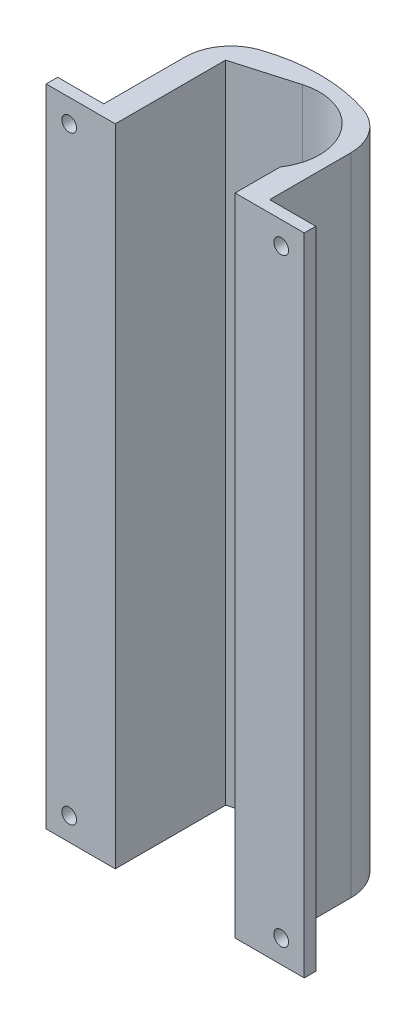
ISO-10303-21;
HEADER;
FILE_DESCRIPTION(('STEP AP214'),'2;1');
FILE_NAME('part.step','',(''),(''),'','','');
FILE_SCHEMA(('AUTOMOTIVE_DESIGN { 1 0 10303 214 1 1 1 1 }'));
ENDSEC;
DATA;
#1=APPLICATION_CONTEXT('core data for automotive mechanical design processes');
#2=APPLICATION_PROTOCOL_DEFINITION('international standard','automotive_design',2000,#1);
#3=PRODUCT_CONTEXT('',#1,'mechanical');
#4=PRODUCT('Part','Part','',(#3));
#5=PRODUCT_RELATED_PRODUCT_CATEGORY('part','',(#4));
#6=PRODUCT_DEFINITION_FORMATION('','',#4);
#7=PRODUCT_DEFINITION_CONTEXT('part definition',#1,'design');
#8=PRODUCT_DEFINITION('design','',#6,#7);
#9=PRODUCT_DEFINITION_SHAPE('','',#8);
#10=(LENGTH_UNIT() NAMED_UNIT(*) SI_UNIT(.MILLI.,.METRE.));
#11=(NAMED_UNIT(*) PLANE_ANGLE_UNIT() SI_UNIT($,.RADIAN.));
#12=(NAMED_UNIT(*) SI_UNIT($,.STERADIAN.) SOLID_ANGLE_UNIT());
#13=UNCERTAINTY_MEASURE_WITH_UNIT(LENGTH_MEASURE(1.E-05),#10,'distance_accuracy_value','');
#14=(GEOMETRIC_REPRESENTATION_CONTEXT(3) GLOBAL_UNCERTAINTY_ASSIGNED_CONTEXT((#13)) GLOBAL_UNIT_ASSIGNED_CONTEXT((#10,
#11,#12)) REPRESENTATION_CONTEXT('',''));
#15=CARTESIAN_POINT('',(0.,0.,0.));
#16=DIRECTION('',(0.,0.,1.));
#17=DIRECTION('',(1.,0.,0.));
#18=AXIS2_PLACEMENT_3D('',#15,#16,#17);
#19=CARTESIAN_POINT('',(0.,177.8,74.9201803451045));
#20=DIRECTION('',(0.,-1.,0.));
#21=DIRECTION('',(0.,0.,-1.));
#22=AXIS2_PLACEMENT_3D('',#19,#20,#21);
#23=CYLINDRICAL_SURFACE('',#22,14.9862811380157);
#24=CARTESIAN_POINT('',(0.,0.,74.9201803451045));
#25=DIRECTION('',(0.,-1.,0.));
#26=DIRECTION('',(0.,0.,-1.));
#27=AXIS2_PLACEMENT_3D('',#24,#25,#26);
#28=CIRCLE('',#27,14.9862811380157);
#29=CARTESIAN_POINT('',(-4.16201958345776,0.,60.5234371253843));
#30=VERTEX_POINT('',#29);
#31=CARTESIAN_POINT('',(12.446,0.,83.2679768416446));
#32=VERTEX_POINT('',#31);
#33=EDGE_CURVE('E178',#30,#32,#28,.T.);
#34=ORIENTED_EDGE('',*,*,#33,.T.);
#35=DIRECTION('',(0.,-1.,0.));
#36=VECTOR('',#35,1.);
#37=CARTESIAN_POINT('',(12.446,177.8,83.2679768416446));
#38=LINE('',#37,#36);
#39=CARTESIAN_POINT('',(12.446,177.8,83.2679768416446));
#40=VERTEX_POINT('',#39);
#41=EDGE_CURVE('E158',#40,#32,#38,.T.);
#42=ORIENTED_EDGE('',*,*,#41,.F.);
#43=CARTESIAN_POINT('',(0.,177.8,74.9201803451045));
#44=DIRECTION('',(0.,-1.,0.));
#45=DIRECTION('',(0.,0.,-1.));
#46=AXIS2_PLACEMENT_3D('',#43,#44,#45);
#47=CIRCLE('',#46,14.9862811380157);
#48=CARTESIAN_POINT('',(-4.16201958345776,177.8,60.5234371253843));
#49=VERTEX_POINT('',#48);
#50=EDGE_CURVE('E165',#49,#40,#47,.T.);
#51=ORIENTED_EDGE('',*,*,#50,.F.);
#52=DIRECTION('',(0.,-1.,0.));
#53=VECTOR('',#52,1.);
#54=CARTESIAN_POINT('',(-4.16201958345776,177.8,60.5234371253843));
#55=LINE('',#54,#53);
#56=EDGE_CURVE('E256',#49,#30,#55,.T.);
#57=ORIENTED_EDGE('',*,*,#56,.T.);
#58=EDGE_LOOP('',(#34,#42,#51,#57));
#59=FACE_BOUND('',#58,.T.);
#60=ADVANCED_FACE('F43',(#59),#23,.F.);
#61=CARTESIAN_POINT('',(12.446,177.8,95.666893232235));
#62=DIRECTION('',(1.,0.,0.));
#63=DIRECTION('',(0.,0.,-1.));
#64=AXIS2_PLACEMENT_3D('',#61,#62,#63);
#65=PLANE('',#64);
#66=DIRECTION('',(0.,0.,1.));
#67=VECTOR('',#66,1.);
#68=CARTESIAN_POINT('',(12.446,0.,95.666893232235));
#69=LINE('',#68,#67);
#70=CARTESIAN_POINT('',(12.446,0.,95.666893232235));
#71=VERTEX_POINT('',#70);
#72=EDGE_CURVE('E298',#32,#71,#69,.T.);
#73=ORIENTED_EDGE('',*,*,#72,.T.);
#74=DIRECTION('',(0.,-1.,0.));
#75=VECTOR('',#74,1.);
#76=CARTESIAN_POINT('',(12.446,177.8,95.666893232235));
#77=LINE('',#76,#75);
#78=CARTESIAN_POINT('',(12.446,177.8,95.666893232235));
#79=VERTEX_POINT('',#78);
#80=EDGE_CURVE('E161',#79,#71,#77,.T.);
#81=ORIENTED_EDGE('',*,*,#80,.F.);
#82=DIRECTION('',(0.,0.,1.));
#83=VECTOR('',#82,1.);
#84=CARTESIAN_POINT('',(12.446,177.8,95.666893232235));
#85=LINE('',#84,#83);
#86=EDGE_CURVE('E154',#40,#79,#85,.T.);
#87=ORIENTED_EDGE('',*,*,#86,.F.);
#88=ORIENTED_EDGE('',*,*,#41,.T.);
#89=EDGE_LOOP('',(#73,#81,#87,#88));
#90=FACE_BOUND('',#89,.T.);
#91=ADVANCED_FACE('F156',(#90),#65,.F.);
#92=CARTESIAN_POINT('',(12.446,177.8,95.666893232235));
#93=DIRECTION('',(0.,0.,-1.));
#94=DIRECTION('',(-1.,0.,0.));
#95=AXIS2_PLACEMENT_3D('',#92,#93,#94);
#96=PLANE('',#95);
#97=CARTESIAN_POINT('',(25.146,6.35,95.666893232235));
#98=DIRECTION('',(0.,0.,-1.));
#99=DIRECTION('',(-1.,0.,0.));
#100=AXIS2_PLACEMENT_3D('',#97,#98,#99);
#101=CIRCLE('',#100,2.03200000000001);
#102=CARTESIAN_POINT('',(23.114,6.35,95.666893232235));
#103=VERTEX_POINT('',#102);
#104=EDGE_CURVE('E335',#103,#103,#101,.T.);
#105=ORIENTED_EDGE('',*,*,#104,.T.);
#106=EDGE_LOOP('',(#105));
#107=FACE_BOUND('',#106,.T.);
#108=CARTESIAN_POINT('',(25.146,171.45,95.666893232235));
#109=DIRECTION('',(0.,0.,-1.));
#110=DIRECTION('',(-1.,0.,0.));
#111=AXIS2_PLACEMENT_3D('',#108,#109,#110);
#112=CIRCLE('',#111,2.03200000000002);
#113=CARTESIAN_POINT('',(23.114,171.45,95.666893232235));
#114=VERTEX_POINT('',#113);
#115=EDGE_CURVE('E305',#114,#114,#112,.T.);
#116=ORIENTED_EDGE('',*,*,#115,.T.);
#117=EDGE_LOOP('',(#116));
#118=FACE_BOUND('',#117,.T.);
#119=DIRECTION('',(1.,0.,0.));
#120=VECTOR('',#119,1.);
#121=CARTESIAN_POINT('',(12.446,0.,95.666893232235));
#122=LINE('',#121,#120);
#123=CARTESIAN_POINT('',(31.496,0.,95.666893232235));
#124=VERTEX_POINT('',#123);
#125=EDGE_CURVE('E295',#71,#124,#122,.T.);
#126=ORIENTED_EDGE('',*,*,#125,.T.);
#127=DIRECTION('',(0.,-1.,0.));
#128=VECTOR('',#127,1.);
#129=CARTESIAN_POINT('',(31.496,177.8,95.666893232235));
#130=LINE('',#129,#128);
#131=CARTESIAN_POINT('',(31.496,177.8,95.666893232235));
#132=VERTEX_POINT('',#131);
#133=EDGE_CURVE('E186',#132,#124,#130,.T.);
#134=ORIENTED_EDGE('',*,*,#133,.F.);
#135=DIRECTION('',(1.,0.,0.));
#136=VECTOR('',#135,1.);
#137=CARTESIAN_POINT('',(12.446,177.8,95.666893232235));
#138=LINE('',#137,#136);
#139=EDGE_CURVE('E164',#79,#132,#138,.T.);
#140=ORIENTED_EDGE('',*,*,#139,.F.);
#141=ORIENTED_EDGE('',*,*,#80,.T.);
#142=EDGE_LOOP('',(#126,#134,#140,#141));
#143=FACE_BOUND('',#142,.T.);
#144=ADVANCED_FACE('F409',(#107,#118,#143),#96,.F.);
#145=CARTESIAN_POINT('',(31.496,177.8,95.666893232235));
#146=DIRECTION('',(-1.,0.,0.));
#147=DIRECTION('',(0.,0.,1.));
#148=AXIS2_PLACEMENT_3D('',#145,#146,#147);
#149=PLANE('',#148);
#150=DIRECTION('',(0.,0.,-1.));
#151=VECTOR('',#150,1.);
#152=CARTESIAN_POINT('',(31.496,0.,95.666893232235));
#153=LINE('',#152,#151);
#154=CARTESIAN_POINT('',(31.496,0.,92.491893232235));
#155=VERTEX_POINT('',#154);
#156=EDGE_CURVE('E235',#124,#155,#153,.T.);
#157=ORIENTED_EDGE('',*,*,#156,.T.);
#158=DIRECTION('',(0.,-1.,0.));
#159=VECTOR('',#158,1.);
#160=CARTESIAN_POINT('',(31.496,177.8,92.491893232235));
#161=LINE('',#160,#159);
#162=CARTESIAN_POINT('',(31.496,177.8,92.491893232235));
#163=VERTEX_POINT('',#162);
#164=EDGE_CURVE('E281',#163,#155,#161,.T.);
#165=ORIENTED_EDGE('',*,*,#164,.F.);
#166=DIRECTION('',(0.,0.,-1.));
#167=VECTOR('',#166,1.);
#168=CARTESIAN_POINT('',(31.496,177.8,95.666893232235));
#169=LINE('',#168,#167);
#170=EDGE_CURVE('E292',#132,#163,#169,.T.);
#171=ORIENTED_EDGE('',*,*,#170,.F.);
#172=ORIENTED_EDGE('',*,*,#133,.T.);
#173=EDGE_LOOP('',(#157,#165,#171,#172));
#174=FACE_BOUND('',#173,.T.);
#175=ADVANCED_FACE('F290',(#174),#149,.F.);
#176=CARTESIAN_POINT('',(31.496,177.8,92.491893232235));
#177=DIRECTION('',(0.,0.,1.));
#178=DIRECTION('',(1.,0.,0.));
#179=AXIS2_PLACEMENT_3D('',#176,#177,#178);
#180=PLANE('',#179);
#181=CARTESIAN_POINT('',(25.146,6.35,92.491893232235));
#182=DIRECTION('',(0.,0.,-1.));
#183=DIRECTION('',(-1.,0.,0.));
#184=AXIS2_PLACEMENT_3D('',#181,#182,#183);
#185=CIRCLE('',#184,2.03200000000001);
#186=CARTESIAN_POINT('',(23.114,6.35,92.491893232235));
#187=VERTEX_POINT('',#186);
#188=EDGE_CURVE('E348',#187,#187,#185,.T.);
#189=ORIENTED_EDGE('',*,*,#188,.F.);
#190=EDGE_LOOP('',(#189));
#191=FACE_BOUND('',#190,.T.);
#192=CARTESIAN_POINT('',(25.146,171.45,92.491893232235));
#193=DIRECTION('',(0.,0.,-1.));
#194=DIRECTION('',(-1.,0.,0.));
#195=AXIS2_PLACEMENT_3D('',#192,#193,#194);
#196=CIRCLE('',#195,2.03200000000002);
#197=CARTESIAN_POINT('',(23.114,171.45,92.491893232235));
#198=VERTEX_POINT('',#197);
#199=EDGE_CURVE('E331',#198,#198,#196,.T.);
#200=ORIENTED_EDGE('',*,*,#199,.F.);
#201=EDGE_LOOP('',(#200));
#202=FACE_BOUND('',#201,.T.);
#203=DIRECTION('',(-1.,0.,0.));
#204=VECTOR('',#203,1.);
#205=CARTESIAN_POINT('',(31.496,0.,92.491893232235));
#206=LINE('',#205,#204);
#207=CARTESIAN_POINT('',(18.796,0.,92.491893232235));
#208=VERTEX_POINT('',#207);
#209=EDGE_CURVE('E229',#155,#208,#206,.T.);
#210=ORIENTED_EDGE('',*,*,#209,.T.);
#211=DIRECTION('',(0.,-1.,0.));
#212=VECTOR('',#211,1.);
#213=CARTESIAN_POINT('',(18.796,177.8,92.491893232235));
#214=LINE('',#213,#212);
#215=CARTESIAN_POINT('',(18.796,177.8,92.491893232235));
#216=VERTEX_POINT('',#215);
#217=EDGE_CURVE('E227',#216,#208,#214,.T.);
#218=ORIENTED_EDGE('',*,*,#217,.F.);
#219=DIRECTION('',(-1.,0.,0.));
#220=VECTOR('',#219,1.);
#221=CARTESIAN_POINT('',(31.496,177.8,92.491893232235));
#222=LINE('',#221,#220);
#223=EDGE_CURVE('E324',#163,#216,#222,.T.);
#224=ORIENTED_EDGE('',*,*,#223,.F.);
#225=ORIENTED_EDGE('',*,*,#164,.T.);
#226=EDGE_LOOP('',(#210,#218,#224,#225));
#227=FACE_BOUND('',#226,.T.);
#228=ADVANCED_FACE('F417',(#191,#202,#227),#180,.F.);
#229=CARTESIAN_POINT('',(18.796,177.8,92.491893232235));
#230=DIRECTION('',(-1.,0.,0.));
#231=DIRECTION('',(0.,0.,1.));
#232=AXIS2_PLACEMENT_3D('',#229,#230,#231);
#233=PLANE('',#232);
#234=DIRECTION('',(0.,0.,-1.));
#235=VECTOR('',#234,1.);
#236=CARTESIAN_POINT('',(18.796,0.,92.491893232235));
#237=LINE('',#236,#235);
#238=CARTESIAN_POINT('',(18.796,0.,70.1337045539243));
#239=VERTEX_POINT('',#238);
#240=EDGE_CURVE('E222',#208,#239,#237,.T.);
#241=ORIENTED_EDGE('',*,*,#240,.T.);
#242=DIRECTION('',(0.,-1.,0.));
#243=VECTOR('',#242,1.);
#244=CARTESIAN_POINT('',(18.796,177.8,70.1337045539243));
#245=LINE('',#244,#243);
#246=CARTESIAN_POINT('',(18.796,177.8,70.1337045539243));
#247=VERTEX_POINT('',#246);
#248=EDGE_CURVE('E67',#239,#247,#245,.F.);
#249=ORIENTED_EDGE('',*,*,#248,.T.);
#250=DIRECTION('',(0.,0.,-1.));
#251=VECTOR('',#250,1.);
#252=CARTESIAN_POINT('',(18.796,177.8,92.491893232235));
#253=LINE('',#252,#251);
#254=EDGE_CURVE('E206',#216,#247,#253,.T.);
#255=ORIENTED_EDGE('',*,*,#254,.F.);
#256=ORIENTED_EDGE('',*,*,#217,.T.);
#257=EDGE_LOOP('',(#241,#249,#255,#256));
#258=FACE_BOUND('',#257,.T.);
#259=ADVANCED_FACE('F225',(#258),#233,.F.);
#260=CARTESIAN_POINT('',(-4.064,177.8,100.214211531035));
#261=DIRECTION('',(0.,-1.,0.));
#262=DIRECTION('',(0.,0.,-1.));
#263=AXIS2_PLACEMENT_3D('',#260,#261,#262);
#264=CYLINDRICAL_SURFACE('',#263,44.45);
#265=CARTESIAN_POINT('',(-4.064,177.8,100.214211531035));
#266=DIRECTION('',(0.,1.,0.));
#267=DIRECTION('',(0.,0.,-1.));
#268=AXIS2_PLACEMENT_3D('',#265,#266,#267);
#269=CIRCLE('',#268,44.45);
#270=CARTESIAN_POINT('',(10.16,177.8,58.1015017630801));
#271=VERTEX_POINT('',#270);
#272=CARTESIAN_POINT('',(-18.288,177.8,58.1015017630801));
#273=VERTEX_POINT('',#272);
#274=EDGE_CURVE('E205',#271,#273,#269,.T.);
#275=ORIENTED_EDGE('',*,*,#274,.F.);
#276=DIRECTION('',(0.,-1.,0.));
#277=VECTOR('',#276,1.);
#278=CARTESIAN_POINT('',(10.16,177.8,58.1015017630801));
#279=LINE('',#278,#277);
#280=CARTESIAN_POINT('',(10.16,0.,58.1015017630801));
#281=VERTEX_POINT('',#280);
#282=EDGE_CURVE('E184',#271,#281,#279,.T.);
#283=ORIENTED_EDGE('',*,*,#282,.T.);
#284=CARTESIAN_POINT('',(-4.064,0.,100.214211531035));
#285=DIRECTION('',(0.,1.,0.));
#286=DIRECTION('',(0.,0.,-1.));
#287=AXIS2_PLACEMENT_3D('',#284,#285,#286);
#288=CIRCLE('',#287,44.45);
#289=CARTESIAN_POINT('',(-18.288,0.,58.1015017630801));
#290=VERTEX_POINT('',#289);
#291=EDGE_CURVE('E223',#281,#290,#288,.T.);
#292=ORIENTED_EDGE('',*,*,#291,.T.);
#293=DIRECTION('',(0.,-1.,0.));
#294=VECTOR('',#293,1.);
#295=CARTESIAN_POINT('',(-18.288,177.8,58.1015017630801));
#296=LINE('',#295,#294);
#297=EDGE_CURVE('E180',#290,#273,#296,.F.);
#298=ORIENTED_EDGE('',*,*,#297,.T.);
#299=EDGE_LOOP('',(#275,#283,#292,#298));
#300=FACE_BOUND('',#299,.T.);
#301=ADVANCED_FACE('F210',(#300),#264,.T.);
#302=CARTESIAN_POINT('',(-26.924,177.8,92.491893232235));
#303=DIRECTION('',(1.,0.,0.));
#304=DIRECTION('',(0.,0.,-1.));
#305=AXIS2_PLACEMENT_3D('',#302,#303,#304);
#306=PLANE('',#305);
#307=DIRECTION('',(0.,0.,1.));
#308=VECTOR('',#307,1.);
#309=CARTESIAN_POINT('',(-26.924,177.8,92.491893232235));
#310=LINE('',#309,#308);
#311=CARTESIAN_POINT('',(-26.924,177.8,70.1337045539244));
#312=VERTEX_POINT('',#311);
#313=CARTESIAN_POINT('',(-26.924,177.8,92.491893232235));
#314=VERTEX_POINT('',#313);
#315=EDGE_CURVE('E215',#312,#314,#310,.T.);
#316=ORIENTED_EDGE('',*,*,#315,.F.);
#317=DIRECTION('',(0.,-1.,0.));
#318=VECTOR('',#317,1.);
#319=CARTESIAN_POINT('',(-26.924,177.8,70.1337045539244));
#320=LINE('',#319,#318);
#321=CARTESIAN_POINT('',(-26.924,0.,70.1337045539244));
#322=VERTEX_POINT('',#321);
#323=EDGE_CURVE('E11',#312,#322,#320,.T.);
#324=ORIENTED_EDGE('',*,*,#323,.T.);
#325=DIRECTION('',(0.,0.,1.));
#326=VECTOR('',#325,1.);
#327=CARTESIAN_POINT('',(-26.924,0.,92.491893232235));
#328=LINE('',#327,#326);
#329=CARTESIAN_POINT('',(-26.924,0.,92.491893232235));
#330=VERTEX_POINT('',#329);
#331=EDGE_CURVE('E233',#322,#330,#328,.T.);
#332=ORIENTED_EDGE('',*,*,#331,.T.);
#333=DIRECTION('',(0.,-1.,0.));
#334=VECTOR('',#333,1.);
#335=CARTESIAN_POINT('',(-26.924,177.8,92.491893232235));
#336=LINE('',#335,#334);
#337=EDGE_CURVE('E275',#314,#330,#336,.T.);
#338=ORIENTED_EDGE('',*,*,#337,.F.);
#339=EDGE_LOOP('',(#316,#324,#332,#338));
#340=FACE_BOUND('',#339,.T.);
#341=ADVANCED_FACE('F377',(#340),#306,.F.);
#342=CARTESIAN_POINT('',(-39.624,177.8,92.491893232235));
#343=DIRECTION('',(0.,0.,1.));
#344=DIRECTION('',(1.,0.,0.));
#345=AXIS2_PLACEMENT_3D('',#342,#343,#344);
#346=PLANE('',#345);
#347=CARTESIAN_POINT('',(-33.274,171.45,92.491893232235));
#348=DIRECTION('',(0.,0.,-1.));
#349=DIRECTION('',(-1.,0.,0.));
#350=AXIS2_PLACEMENT_3D('',#347,#348,#349);
#351=CIRCLE('',#350,2.03200000000003);
#352=CARTESIAN_POINT('',(-35.306,171.45,92.491893232235));
#353=VERTEX_POINT('',#352);
#354=EDGE_CURVE('E339',#353,#353,#351,.T.);
#355=ORIENTED_EDGE('',*,*,#354,.F.);
#356=EDGE_LOOP('',(#355));
#357=FACE_BOUND('',#356,.T.);
#358=CARTESIAN_POINT('',(-33.2739999999999,6.35000000000002,92.491893232235));
#359=DIRECTION('',(0.,0.,-1.));
#360=DIRECTION('',(-1.,0.,0.));
#361=AXIS2_PLACEMENT_3D('',#358,#359,#360);
#362=CIRCLE('',#361,2.03200000000001);
#363=CARTESIAN_POINT('',(-35.3059999999999,6.35000000000002,92.491893232235));
#364=VERTEX_POINT('',#363);
#365=EDGE_CURVE('E355',#364,#364,#362,.T.);
#366=ORIENTED_EDGE('',*,*,#365,.F.);
#367=EDGE_LOOP('',(#366));
#368=FACE_BOUND('',#367,.T.);
#369=DIRECTION('',(-1.,0.,0.));
#370=VECTOR('',#369,1.);
#371=CARTESIAN_POINT('',(-39.624,0.,92.491893232235));
#372=LINE('',#371,#370);
#373=CARTESIAN_POINT('',(-39.624,0.,92.491893232235));
#374=VERTEX_POINT('',#373);
#375=EDGE_CURVE('E241',#330,#374,#372,.T.);
#376=ORIENTED_EDGE('',*,*,#375,.T.);
#377=DIRECTION('',(0.,-1.,0.));
#378=VECTOR('',#377,1.);
#379=CARTESIAN_POINT('',(-39.624,177.8,92.491893232235));
#380=LINE('',#379,#378);
#381=CARTESIAN_POINT('',(-39.624,177.8,92.491893232235));
#382=VERTEX_POINT('',#381);
#383=EDGE_CURVE('E271',#382,#374,#380,.T.);
#384=ORIENTED_EDGE('',*,*,#383,.F.);
#385=DIRECTION('',(-1.,0.,0.));
#386=VECTOR('',#385,1.);
#387=CARTESIAN_POINT('',(-39.624,177.8,92.491893232235));
#388=LINE('',#387,#386);
#389=EDGE_CURVE('E317',#314,#382,#388,.T.);
#390=ORIENTED_EDGE('',*,*,#389,.F.);
#391=ORIENTED_EDGE('',*,*,#337,.T.);
#392=EDGE_LOOP('',(#376,#384,#390,#391));
#393=FACE_BOUND('',#392,.T.);
#394=ADVANCED_FACE('F373',(#357,#368,#393),#346,.F.);
#395=CARTESIAN_POINT('',(-39.624,177.8,95.666893232235));
#396=DIRECTION('',(1.,0.,0.));
#397=DIRECTION('',(0.,0.,-1.));
#398=AXIS2_PLACEMENT_3D('',#395,#396,#397);
#399=PLANE('',#398);
#400=DIRECTION('',(0.,0.,1.));
#401=VECTOR('',#400,1.);
#402=CARTESIAN_POINT('',(-39.624,0.,95.666893232235));
#403=LINE('',#402,#401);
#404=CARTESIAN_POINT('',(-39.624,0.,95.666893232235));
#405=VERTEX_POINT('',#404);
#406=EDGE_CURVE('E244',#374,#405,#403,.T.);
#407=ORIENTED_EDGE('',*,*,#406,.T.);
#408=DIRECTION('',(0.,-1.,0.));
#409=VECTOR('',#408,1.);
#410=CARTESIAN_POINT('',(-39.624,177.8,95.666893232235));
#411=LINE('',#410,#409);
#412=CARTESIAN_POINT('',(-39.624,177.8,95.666893232235));
#413=VERTEX_POINT('',#412);
#414=EDGE_CURVE('E267',#413,#405,#411,.T.);
#415=ORIENTED_EDGE('',*,*,#414,.F.);
#416=DIRECTION('',(0.,0.,1.));
#417=VECTOR('',#416,1.);
#418=CARTESIAN_POINT('',(-39.624,177.8,95.666893232235));
#419=LINE('',#418,#417);
#420=EDGE_CURVE('E314',#382,#413,#419,.T.);
#421=ORIENTED_EDGE('',*,*,#420,.F.);
#422=ORIENTED_EDGE('',*,*,#383,.T.);
#423=EDGE_LOOP('',(#407,#415,#421,#422));
#424=FACE_BOUND('',#423,.T.);
#425=ADVANCED_FACE('F376',(#424),#399,.F.);
#426=CARTESIAN_POINT('',(-39.624,177.8,95.666893232235));
#427=DIRECTION('',(0.,0.,-1.));
#428=DIRECTION('',(-1.,0.,0.));
#429=AXIS2_PLACEMENT_3D('',#426,#427,#428);
#430=PLANE('',#429);
#431=CARTESIAN_POINT('',(-33.274,171.45,95.666893232235));
#432=DIRECTION('',(0.,0.,-1.));
#433=DIRECTION('',(-1.,0.,0.));
#434=AXIS2_PLACEMENT_3D('',#431,#432,#433);
#435=CIRCLE('',#434,2.03200000000003);
#436=CARTESIAN_POINT('',(-35.306,171.45,95.666893232235));
#437=VERTEX_POINT('',#436);
#438=EDGE_CURVE('E343',#437,#437,#435,.T.);
#439=ORIENTED_EDGE('',*,*,#438,.T.);
#440=EDGE_LOOP('',(#439));
#441=FACE_BOUND('',#440,.T.);
#442=CARTESIAN_POINT('',(-33.2739999999999,6.35000000000002,95.666893232235));
#443=DIRECTION('',(0.,0.,-1.));
#444=DIRECTION('',(-1.,0.,0.));
#445=AXIS2_PLACEMENT_3D('',#442,#443,#444);
#446=CIRCLE('',#445,2.03200000000001);
#447=CARTESIAN_POINT('',(-35.3059999999999,6.35000000000002,95.666893232235));
#448=VERTEX_POINT('',#447);
#449=EDGE_CURVE('E344',#448,#448,#446,.T.);
#450=ORIENTED_EDGE('',*,*,#449,.T.);
#451=EDGE_LOOP('',(#450));
#452=FACE_BOUND('',#451,.T.);
#453=DIRECTION('',(1.,0.,0.));
#454=VECTOR('',#453,1.);
#455=CARTESIAN_POINT('',(-39.624,0.,95.666893232235));
#456=LINE('',#455,#454);
#457=CARTESIAN_POINT('',(-20.574,0.,95.666893232235));
#458=VERTEX_POINT('',#457);
#459=EDGE_CURVE('E247',#405,#458,#456,.T.);
#460=ORIENTED_EDGE('',*,*,#459,.T.);
#461=DIRECTION('',(0.,-1.,0.));
#462=VECTOR('',#461,1.);
#463=CARTESIAN_POINT('',(-20.574,177.8,95.666893232235));
#464=LINE('',#463,#462);
#465=CARTESIAN_POINT('',(-20.574,177.8,95.666893232235));
#466=VERTEX_POINT('',#465);
#467=EDGE_CURVE('E263',#466,#458,#464,.T.);
#468=ORIENTED_EDGE('',*,*,#467,.F.);
#469=DIRECTION('',(1.,0.,0.));
#470=VECTOR('',#469,1.);
#471=CARTESIAN_POINT('',(-39.624,177.8,95.666893232235));
#472=LINE('',#471,#470);
#473=EDGE_CURVE('E311',#413,#466,#472,.T.);
#474=ORIENTED_EDGE('',*,*,#473,.F.);
#475=ORIENTED_EDGE('',*,*,#414,.T.);
#476=EDGE_LOOP('',(#460,#468,#474,#475));
#477=FACE_BOUND('',#476,.T.);
#478=ADVANCED_FACE('F363',(#441,#452,#477),#430,.F.);
#479=CARTESIAN_POINT('',(-20.574,177.8,84.5721803451045));
#480=DIRECTION('',(-1.,0.,0.));
#481=DIRECTION('',(0.,0.,1.));
#482=AXIS2_PLACEMENT_3D('',#479,#480,#481);
#483=PLANE('',#482);
#484=DIRECTION('',(0.,0.,-1.));
#485=VECTOR('',#484,1.);
#486=CARTESIAN_POINT('',(-20.574,0.,84.5721803451045));
#487=LINE('',#486,#485);
#488=CARTESIAN_POINT('',(-20.574,0.,65.2680507407337));
#489=VERTEX_POINT('',#488);
#490=EDGE_CURVE('E251',#458,#489,#487,.T.);
#491=ORIENTED_EDGE('',*,*,#490,.T.);
#492=DIRECTION('',(0.,-1.,0.));
#493=VECTOR('',#492,1.);
#494=CARTESIAN_POINT('',(-20.574,177.8,65.2680507407337));
#495=LINE('',#494,#493);
#496=CARTESIAN_POINT('',(-20.574,177.8,65.2680507407337));
#497=VERTEX_POINT('',#496);
#498=EDGE_CURVE('E259',#497,#489,#495,.T.);
#499=ORIENTED_EDGE('',*,*,#498,.F.);
#500=DIRECTION('',(0.,0.,-1.));
#501=VECTOR('',#500,1.);
#502=CARTESIAN_POINT('',(-20.574,177.8,84.5721803451045));
#503=LINE('',#502,#501);
#504=EDGE_CURVE('E308',#466,#497,#503,.T.);
#505=ORIENTED_EDGE('',*,*,#504,.F.);
#506=ORIENTED_EDGE('',*,*,#467,.T.);
#507=EDGE_LOOP('',(#491,#499,#505,#506));
#508=FACE_BOUND('',#507,.T.);
#509=ADVANCED_FACE('F395',(#508),#483,.F.);
#510=CARTESIAN_POINT('',(-20.574,177.8,65.2680507407337));
#511=DIRECTION('',(-0.27772197419278,0.,-0.960661493477523));
#512=DIRECTION('',(-0.960661493477523,0.,0.27772197419278));
#513=AXIS2_PLACEMENT_3D('',#510,#511,#512);
#514=PLANE('',#513);
#515=DIRECTION('',(0.960661493477523,0.,-0.27772197419278));
#516=VECTOR('',#515,1.);
#517=CARTESIAN_POINT('',(-20.574,0.,65.2680507407337));
#518=LINE('',#517,#516);
#519=EDGE_CURVE('E175',#489,#30,#518,.T.);
#520=ORIENTED_EDGE('',*,*,#519,.T.);
#521=ORIENTED_EDGE('',*,*,#56,.F.);
#522=DIRECTION('',(0.960661493477523,0.,-0.27772197419278));
#523=VECTOR('',#522,1.);
#524=CARTESIAN_POINT('',(-20.574,177.8,65.2680507407337));
#525=LINE('',#524,#523);
#526=EDGE_CURVE('E170',#497,#49,#525,.T.);
#527=ORIENTED_EDGE('',*,*,#526,.F.);
#528=ORIENTED_EDGE('',*,*,#498,.T.);
#529=EDGE_LOOP('',(#520,#521,#527,#528));
#530=FACE_BOUND('',#529,.T.);
#531=ADVANCED_FACE('F434',(#530),#514,.F.);
#532=CARTESIAN_POINT('',(0.,177.8,74.9201803451045));
#533=DIRECTION('',(0.,-1.,0.));
#534=DIRECTION('',(0.,0.,-1.));
#535=AXIS2_PLACEMENT_3D('',#532,#533,#534);
#536=PLANE('',#535);
#537=ORIENTED_EDGE('',*,*,#254,.T.);
#538=CARTESIAN_POINT('',(6.09599999999999,177.8,70.1337045539243));
#539=DIRECTION('',(0.,-1.,0.));
#540=DIRECTION('',(0.,0.,-1.));
#541=AXIS2_PLACEMENT_3D('',#538,#539,#540);
#542=CIRCLE('',#541,12.7);
#543=EDGE_CURVE('E52',#247,#271,#542,.F.);
#544=ORIENTED_EDGE('',*,*,#543,.T.);
#545=ORIENTED_EDGE('',*,*,#274,.T.);
#546=CARTESIAN_POINT('',(-14.224,177.8,70.1337045539244));
#547=DIRECTION('',(0.,-1.,0.));
#548=DIRECTION('',(0.,0.,-1.));
#549=AXIS2_PLACEMENT_3D('',#546,#547,#548);
#550=CIRCLE('',#549,12.7);
#551=EDGE_CURVE('E59',#273,#312,#550,.F.);
#552=ORIENTED_EDGE('',*,*,#551,.T.);
#553=ORIENTED_EDGE('',*,*,#315,.T.);
#554=ORIENTED_EDGE('',*,*,#389,.T.);
#555=ORIENTED_EDGE('',*,*,#420,.T.);
#556=ORIENTED_EDGE('',*,*,#473,.T.);
#557=ORIENTED_EDGE('',*,*,#504,.T.);
#558=ORIENTED_EDGE('',*,*,#526,.T.);
#559=ORIENTED_EDGE('',*,*,#50,.T.);
#560=ORIENTED_EDGE('',*,*,#86,.T.);
#561=ORIENTED_EDGE('',*,*,#139,.T.);
#562=ORIENTED_EDGE('',*,*,#170,.T.);
#563=ORIENTED_EDGE('',*,*,#223,.T.);
#564=EDGE_LOOP('',(#537,#544,#545,#552,#553,#554,#555,#556,#557,#558,#559,#560,#561,#562,#563));
#565=FACE_BOUND('',#564,.T.);
#566=ADVANCED_FACE('F168',(#565),#536,.F.);
#567=CARTESIAN_POINT('',(0.,0.,74.9201803451045));
#568=DIRECTION('',(0.,-1.,0.));
#569=DIRECTION('',(0.,0.,-1.));
#570=AXIS2_PLACEMENT_3D('',#567,#568,#569);
#571=PLANE('',#570);
#572=ORIENTED_EDGE('',*,*,#291,.F.);
#573=CARTESIAN_POINT('',(6.09599999999999,0.,70.1337045539243));
#574=DIRECTION('',(0.,-1.,0.));
#575=DIRECTION('',(0.,0.,-1.));
#576=AXIS2_PLACEMENT_3D('',#573,#574,#575);
#577=CIRCLE('',#576,12.7);
#578=EDGE_CURVE('E196',#281,#239,#577,.T.);
#579=ORIENTED_EDGE('',*,*,#578,.T.);
#580=ORIENTED_EDGE('',*,*,#240,.F.);
#581=ORIENTED_EDGE('',*,*,#209,.F.);
#582=ORIENTED_EDGE('',*,*,#156,.F.);
#583=ORIENTED_EDGE('',*,*,#125,.F.);
#584=ORIENTED_EDGE('',*,*,#72,.F.);
#585=ORIENTED_EDGE('',*,*,#33,.F.);
#586=ORIENTED_EDGE('',*,*,#519,.F.);
#587=ORIENTED_EDGE('',*,*,#490,.F.);
#588=ORIENTED_EDGE('',*,*,#459,.F.);
#589=ORIENTED_EDGE('',*,*,#406,.F.);
#590=ORIENTED_EDGE('',*,*,#375,.F.);
#591=ORIENTED_EDGE('',*,*,#331,.F.);
#592=CARTESIAN_POINT('',(-14.224,0.,70.1337045539244));
#593=DIRECTION('',(0.,-1.,0.));
#594=DIRECTION('',(0.,0.,-1.));
#595=AXIS2_PLACEMENT_3D('',#592,#593,#594);
#596=CIRCLE('',#595,12.7);
#597=EDGE_CURVE('E193',#322,#290,#596,.T.);
#598=ORIENTED_EDGE('',*,*,#597,.T.);
#599=EDGE_LOOP('',(#572,#579,#580,#581,#582,#583,#584,#585,#586,#587,#588,#589,#590,#591,#598));
#600=FACE_BOUND('',#599,.T.);
#601=ADVANCED_FACE('F220',(#600),#571,.T.);
#602=CARTESIAN_POINT('',(6.09599999999999,177.8,70.1337045539243));
#603=DIRECTION('',(0.,-1.,0.));
#604=DIRECTION('',(0.,0.,-1.));
#605=AXIS2_PLACEMENT_3D('',#602,#603,#604);
#606=CYLINDRICAL_SURFACE('',#605,12.7);
#607=ORIENTED_EDGE('',*,*,#543,.F.);
#608=ORIENTED_EDGE('',*,*,#248,.F.);
#609=ORIENTED_EDGE('',*,*,#578,.F.);
#610=ORIENTED_EDGE('',*,*,#282,.F.);
#611=EDGE_LOOP('',(#607,#608,#609,#610));
#612=FACE_BOUND('',#611,.T.);
#613=ADVANCED_FACE('F217',(#612),#606,.T.);
#614=CARTESIAN_POINT('',(-14.224,177.8,70.1337045539244));
#615=DIRECTION('',(0.,-1.,0.));
#616=DIRECTION('',(0.,0.,-1.));
#617=AXIS2_PLACEMENT_3D('',#614,#615,#616);
#618=CYLINDRICAL_SURFACE('',#617,12.7);
#619=ORIENTED_EDGE('',*,*,#551,.F.);
#620=ORIENTED_EDGE('',*,*,#297,.F.);
#621=ORIENTED_EDGE('',*,*,#597,.F.);
#622=ORIENTED_EDGE('',*,*,#323,.F.);
#623=EDGE_LOOP('',(#619,#620,#621,#622));
#624=FACE_BOUND('',#623,.T.);
#625=ADVANCED_FACE('F45',(#624),#618,.T.);
#626=CARTESIAN_POINT('',(-33.2739999999999,6.35000000000002,95.666893232235));
#627=DIRECTION('',(0.,0.,-1.));
#628=DIRECTION('',(-1.,0.,0.));
#629=AXIS2_PLACEMENT_3D('',#626,#627,#628);
#630=CYLINDRICAL_SURFACE('',#629,2.03200000000001);
#631=ORIENTED_EDGE('',*,*,#449,.F.);
#632=EDGE_LOOP('',(#631));
#633=FACE_BOUND('',#632,.T.);
#634=ORIENTED_EDGE('',*,*,#365,.T.);
#635=EDGE_LOOP('',(#634));
#636=FACE_BOUND('',#635,.T.);
#637=ADVANCED_FACE('F366',(#633,#636),#630,.F.);
#638=CARTESIAN_POINT('',(-33.274,171.45,95.666893232235));
#639=DIRECTION('',(0.,0.,-1.));
#640=DIRECTION('',(-1.,0.,0.));
#641=AXIS2_PLACEMENT_3D('',#638,#639,#640);
#642=CYLINDRICAL_SURFACE('',#641,2.03200000000003);
#643=ORIENTED_EDGE('',*,*,#438,.F.);
#644=EDGE_LOOP('',(#643));
#645=FACE_BOUND('',#644,.T.);
#646=ORIENTED_EDGE('',*,*,#354,.T.);
#647=EDGE_LOOP('',(#646));
#648=FACE_BOUND('',#647,.T.);
#649=ADVANCED_FACE('F369',(#645,#648),#642,.F.);
#650=CARTESIAN_POINT('',(25.146,171.45,95.666893232235));
#651=DIRECTION('',(0.,0.,-1.));
#652=DIRECTION('',(-1.,0.,0.));
#653=AXIS2_PLACEMENT_3D('',#650,#651,#652);
#654=CYLINDRICAL_SURFACE('',#653,2.03200000000002);
#655=ORIENTED_EDGE('',*,*,#115,.F.);
#656=EDGE_LOOP('',(#655));
#657=FACE_BOUND('',#656,.T.);
#658=ORIENTED_EDGE('',*,*,#199,.T.);
#659=EDGE_LOOP('',(#658));
#660=FACE_BOUND('',#659,.T.);
#661=ADVANCED_FACE('F442',(#657,#660),#654,.F.);
#662=CARTESIAN_POINT('',(25.146,6.35,95.666893232235));
#663=DIRECTION('',(0.,0.,-1.));
#664=DIRECTION('',(-1.,0.,0.));
#665=AXIS2_PLACEMENT_3D('',#662,#663,#664);
#666=CYLINDRICAL_SURFACE('',#665,2.03200000000001);
#667=ORIENTED_EDGE('',*,*,#104,.F.);
#668=EDGE_LOOP('',(#667));
#669=FACE_BOUND('',#668,.T.);
#670=ORIENTED_EDGE('',*,*,#188,.T.);
#671=EDGE_LOOP('',(#670));
#672=FACE_BOUND('',#671,.T.);
#673=ADVANCED_FACE('F445',(#669,#672),#666,.F.);
#674=CLOSED_SHELL('',(#60,#91,#144,#175,#228,#259,#301,#341,#394,#425,#478,#509,#531,#566,#601,
#613,#625,#637,#649,#661,#673));
#675=MANIFOLD_SOLID_BREP('B2',#674);
#676=ADVANCED_BREP_SHAPE_REPRESENTATION('',(#18,#675),#14);
#677=SHAPE_DEFINITION_REPRESENTATION(#9,#676);
ENDSEC;
END-ISO-10303-21;
